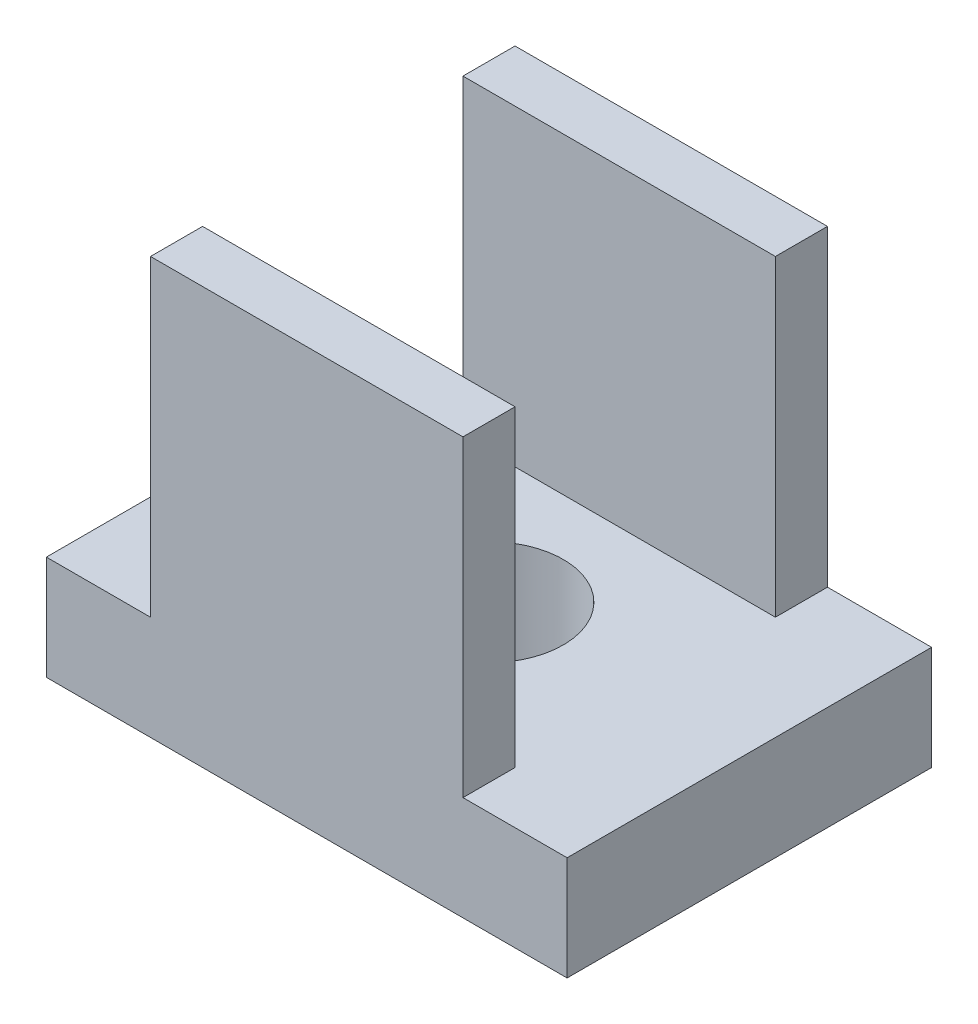
ISO-10303-21;
HEADER;
FILE_DESCRIPTION(('STEP AP214'),'2;1');
FILE_NAME('part.step','',(''),(''),'','','');
FILE_SCHEMA(('AUTOMOTIVE_DESIGN { 1 0 10303 214 1 1 1 1 }'));
ENDSEC;
DATA;
#1=APPLICATION_CONTEXT('core data for automotive mechanical design processes');
#2=APPLICATION_PROTOCOL_DEFINITION('international standard','automotive_design',2000,#1);
#3=PRODUCT_CONTEXT('',#1,'mechanical');
#4=PRODUCT('Part','Part','',(#3));
#5=PRODUCT_RELATED_PRODUCT_CATEGORY('part','',(#4));
#6=PRODUCT_DEFINITION_FORMATION('','',#4);
#7=PRODUCT_DEFINITION_CONTEXT('part definition',#1,'design');
#8=PRODUCT_DEFINITION('design','',#6,#7);
#9=PRODUCT_DEFINITION_SHAPE('','',#8);
#10=(LENGTH_UNIT() NAMED_UNIT(*) SI_UNIT(.MILLI.,.METRE.));
#11=(NAMED_UNIT(*) PLANE_ANGLE_UNIT() SI_UNIT($,.RADIAN.));
#12=(NAMED_UNIT(*) SI_UNIT($,.STERADIAN.) SOLID_ANGLE_UNIT());
#13=UNCERTAINTY_MEASURE_WITH_UNIT(LENGTH_MEASURE(1.E-05),#10,'distance_accuracy_value','');
#14=(GEOMETRIC_REPRESENTATION_CONTEXT(3) GLOBAL_UNCERTAINTY_ASSIGNED_CONTEXT((#13)) GLOBAL_UNIT_ASSIGNED_CONTEXT((#10,
#11,#12)) REPRESENTATION_CONTEXT('',''));
#15=CARTESIAN_POINT('',(0.,0.,0.));
#16=DIRECTION('',(0.,0.,1.));
#17=DIRECTION('',(1.,0.,0.));
#18=AXIS2_PLACEMENT_3D('',#15,#16,#17);
#19=CARTESIAN_POINT('',(0.,2.,0.));
#20=DIRECTION('',(0.,-1.,0.));
#21=DIRECTION('',(0.,0.,-1.));
#22=AXIS2_PLACEMENT_3D('',#19,#20,#21);
#23=PLANE('',#22);
#24=CARTESIAN_POINT('',(0.,2.,0.));
#25=DIRECTION('',(0.,1.,0.));
#26=DIRECTION('',(0.,0.,1.));
#27=AXIS2_PLACEMENT_3D('',#24,#25,#26);
#28=CIRCLE('',#27,1.425);
#29=CARTESIAN_POINT('',(0.,2.,1.425));
#30=VERTEX_POINT('',#29);
#31=EDGE_CURVE('E201',#30,#30,#28,.T.);
#32=ORIENTED_EDGE('',*,*,#31,.F.);
#33=EDGE_LOOP('',(#32));
#34=FACE_BOUND('',#33,.T.);
#35=DIRECTION('',(0.,0.,1.));
#36=VECTOR('',#35,1.);
#37=CARTESIAN_POINT('',(-3.,2.,3.5));
#38=LINE('',#37,#36);
#39=CARTESIAN_POINT('',(-3.,2.,2.5));
#40=VERTEX_POINT('',#39);
#41=CARTESIAN_POINT('',(-3.,2.,3.5));
#42=VERTEX_POINT('',#41);
#43=EDGE_CURVE('E55',#40,#42,#38,.T.);
#44=ORIENTED_EDGE('',*,*,#43,.F.);
#45=DIRECTION('',(-1.,0.,0.));
#46=VECTOR('',#45,1.);
#47=CARTESIAN_POINT('',(-3.,2.,2.5));
#48=LINE('',#47,#46);
#49=CARTESIAN_POINT('',(3.,2.,2.5));
#50=VERTEX_POINT('',#49);
#51=EDGE_CURVE('E59',#50,#40,#48,.T.);
#52=ORIENTED_EDGE('',*,*,#51,.F.);
#53=DIRECTION('',(0.,0.,-1.));
#54=VECTOR('',#53,1.);
#55=CARTESIAN_POINT('',(3.,2.,3.5));
#56=LINE('',#55,#54);
#57=CARTESIAN_POINT('',(3.,2.,3.5));
#58=VERTEX_POINT('',#57);
#59=EDGE_CURVE('E261',#58,#50,#56,.T.);
#60=ORIENTED_EDGE('',*,*,#59,.F.);
#61=DIRECTION('',(1.,0.,0.));
#62=VECTOR('',#61,1.);
#63=CARTESIAN_POINT('',(-5.,2.,3.5));
#64=LINE('',#63,#62);
#65=CARTESIAN_POINT('',(5.,2.,3.5));
#66=VERTEX_POINT('',#65);
#67=EDGE_CURVE('E221',#58,#66,#64,.T.);
#68=ORIENTED_EDGE('',*,*,#67,.T.);
#69=DIRECTION('',(0.,0.,-1.));
#70=VECTOR('',#69,1.);
#71=CARTESIAN_POINT('',(5.,2.,3.5));
#72=LINE('',#71,#70);
#73=CARTESIAN_POINT('',(5.,2.,-3.5));
#74=VERTEX_POINT('',#73);
#75=EDGE_CURVE('E209',#66,#74,#72,.T.);
#76=ORIENTED_EDGE('',*,*,#75,.T.);
#77=DIRECTION('',(-1.,0.,0.));
#78=VECTOR('',#77,1.);
#79=CARTESIAN_POINT('',(-5.,2.,-3.5));
#80=LINE('',#79,#78);
#81=CARTESIAN_POINT('',(3.,2.,-3.5));
#82=VERTEX_POINT('',#81);
#83=EDGE_CURVE('E215',#74,#82,#80,.T.);
#84=ORIENTED_EDGE('',*,*,#83,.T.);
#85=DIRECTION('',(0.,0.,-1.));
#86=VECTOR('',#85,1.);
#87=CARTESIAN_POINT('',(3.,2.,-3.5));
#88=LINE('',#87,#86);
#89=CARTESIAN_POINT('',(3.,2.,-2.5));
#90=VERTEX_POINT('',#89);
#91=EDGE_CURVE('E169',#90,#82,#88,.T.);
#92=ORIENTED_EDGE('',*,*,#91,.F.);
#93=DIRECTION('',(1.,0.,0.));
#94=VECTOR('',#93,1.);
#95=CARTESIAN_POINT('',(-3.,2.,-2.5));
#96=LINE('',#95,#94);
#97=CARTESIAN_POINT('',(-3.,2.,-2.5));
#98=VERTEX_POINT('',#97);
#99=EDGE_CURVE('E158',#98,#90,#96,.T.);
#100=ORIENTED_EDGE('',*,*,#99,.F.);
#101=DIRECTION('',(0.,0.,1.));
#102=VECTOR('',#101,1.);
#103=CARTESIAN_POINT('',(-3.,2.,-3.5));
#104=LINE('',#103,#102);
#105=CARTESIAN_POINT('',(-3.,2.,-3.5));
#106=VERTEX_POINT('',#105);
#107=EDGE_CURVE('E153',#106,#98,#104,.T.);
#108=ORIENTED_EDGE('',*,*,#107,.F.);
#109=CARTESIAN_POINT('',(-5.,2.,-3.5));
#110=VERTEX_POINT('',#109);
#111=EDGE_CURVE('E213',#106,#110,#80,.T.);
#112=ORIENTED_EDGE('',*,*,#111,.T.);
#113=DIRECTION('',(0.,0.,1.));
#114=VECTOR('',#113,1.);
#115=CARTESIAN_POINT('',(-5.,2.,3.5));
#116=LINE('',#115,#114);
#117=CARTESIAN_POINT('',(-5.,2.,3.5));
#118=VERTEX_POINT('',#117);
#119=EDGE_CURVE('E218',#110,#118,#116,.T.);
#120=ORIENTED_EDGE('',*,*,#119,.T.);
#121=EDGE_CURVE('E222',#118,#42,#64,.T.);
#122=ORIENTED_EDGE('',*,*,#121,.T.);
#123=EDGE_LOOP('',(#44,#52,#60,#68,#76,#84,#92,#100,#108,#112,#120,#122));
#124=FACE_BOUND('',#123,.T.);
#125=ADVANCED_FACE('F39',(#34,#124),#23,.F.);
#126=CARTESIAN_POINT('',(5.,2.,3.5));
#127=DIRECTION('',(-1.,0.,0.));
#128=DIRECTION('',(0.,0.,1.));
#129=AXIS2_PLACEMENT_3D('',#126,#127,#128);
#130=PLANE('',#129);
#131=DIRECTION('',(0.,0.,-1.));
#132=VECTOR('',#131,1.);
#133=CARTESIAN_POINT('',(5.,0.,3.5));
#134=LINE('',#133,#132);
#135=CARTESIAN_POINT('',(5.,0.,3.5));
#136=VERTEX_POINT('',#135);
#137=CARTESIAN_POINT('',(5.,0.,-3.5));
#138=VERTEX_POINT('',#137);
#139=EDGE_CURVE('E205',#136,#138,#134,.T.);
#140=ORIENTED_EDGE('',*,*,#139,.T.);
#141=DIRECTION('',(0.,-1.,0.));
#142=VECTOR('',#141,1.);
#143=CARTESIAN_POINT('',(5.,2.,-3.5));
#144=LINE('',#143,#142);
#145=EDGE_CURVE('E11',#74,#138,#144,.T.);
#146=ORIENTED_EDGE('',*,*,#145,.F.);
#147=ORIENTED_EDGE('',*,*,#75,.F.);
#148=DIRECTION('',(0.,-1.,0.));
#149=VECTOR('',#148,1.);
#150=CARTESIAN_POINT('',(5.,2.,3.5));
#151=LINE('',#150,#149);
#152=EDGE_CURVE('E225',#66,#136,#151,.T.);
#153=ORIENTED_EDGE('',*,*,#152,.T.);
#154=EDGE_LOOP('',(#140,#146,#147,#153));
#155=FACE_BOUND('',#154,.T.);
#156=ADVANCED_FACE('F41',(#155),#130,.F.);
#157=CARTESIAN_POINT('',(-5.,2.,-3.5));
#158=DIRECTION('',(0.,0.,1.));
#159=DIRECTION('',(1.,0.,0.));
#160=AXIS2_PLACEMENT_3D('',#157,#158,#159);
#161=PLANE('',#160);
#162=DIRECTION('',(-1.,0.,0.));
#163=VECTOR('',#162,1.);
#164=CARTESIAN_POINT('',(-5.,0.,-3.5));
#165=LINE('',#164,#163);
#166=CARTESIAN_POINT('',(-5.,0.,-3.5));
#167=VERTEX_POINT('',#166);
#168=EDGE_CURVE('E229',#138,#167,#165,.T.);
#169=ORIENTED_EDGE('',*,*,#168,.T.);
#170=DIRECTION('',(0.,-1.,0.));
#171=VECTOR('',#170,1.);
#172=CARTESIAN_POINT('',(-5.,2.,-3.5));
#173=LINE('',#172,#171);
#174=EDGE_CURVE('E48',#110,#167,#173,.T.);
#175=ORIENTED_EDGE('',*,*,#174,.F.);
#176=ORIENTED_EDGE('',*,*,#111,.F.);
#177=DIRECTION('',(0.,-1.,0.));
#178=VECTOR('',#177,1.);
#179=CARTESIAN_POINT('',(-3.,8.,-3.5));
#180=LINE('',#179,#178);
#181=CARTESIAN_POINT('',(-3.,8.,-3.5));
#182=VERTEX_POINT('',#181);
#183=EDGE_CURVE('E177',#182,#106,#180,.T.);
#184=ORIENTED_EDGE('',*,*,#183,.F.);
#185=DIRECTION('',(-1.,0.,0.));
#186=VECTOR('',#185,1.);
#187=CARTESIAN_POINT('',(-3.,8.,-3.5));
#188=LINE('',#187,#186);
#189=CARTESIAN_POINT('',(3.,8.,-3.5));
#190=VERTEX_POINT('',#189);
#191=EDGE_CURVE('E175',#190,#182,#188,.T.);
#192=ORIENTED_EDGE('',*,*,#191,.F.);
#193=DIRECTION('',(0.,-1.,0.));
#194=VECTOR('',#193,1.);
#195=CARTESIAN_POINT('',(3.,8.,-3.5));
#196=LINE('',#195,#194);
#197=EDGE_CURVE('E188',#190,#82,#196,.T.);
#198=ORIENTED_EDGE('',*,*,#197,.T.);
#199=ORIENTED_EDGE('',*,*,#83,.F.);
#200=ORIENTED_EDGE('',*,*,#145,.T.);
#201=EDGE_LOOP('',(#169,#175,#176,#184,#192,#198,#199,#200));
#202=FACE_BOUND('',#201,.T.);
#203=ADVANCED_FACE('F265',(#202),#161,.F.);
#204=CARTESIAN_POINT('',(-5.,2.,3.5));
#205=DIRECTION('',(1.,0.,0.));
#206=DIRECTION('',(0.,0.,-1.));
#207=AXIS2_PLACEMENT_3D('',#204,#205,#206);
#208=PLANE('',#207);
#209=DIRECTION('',(0.,0.,1.));
#210=VECTOR('',#209,1.);
#211=CARTESIAN_POINT('',(-5.,0.,3.5));
#212=LINE('',#211,#210);
#213=CARTESIAN_POINT('',(-5.,0.,3.5));
#214=VERTEX_POINT('',#213);
#215=EDGE_CURVE('E232',#167,#214,#212,.T.);
#216=ORIENTED_EDGE('',*,*,#215,.T.);
#217=DIRECTION('',(0.,-1.,0.));
#218=VECTOR('',#217,1.);
#219=CARTESIAN_POINT('',(-5.,2.,3.5));
#220=LINE('',#219,#218);
#221=EDGE_CURVE('E240',#118,#214,#220,.T.);
#222=ORIENTED_EDGE('',*,*,#221,.F.);
#223=ORIENTED_EDGE('',*,*,#119,.F.);
#224=ORIENTED_EDGE('',*,*,#174,.T.);
#225=EDGE_LOOP('',(#216,#222,#223,#224));
#226=FACE_BOUND('',#225,.T.);
#227=ADVANCED_FACE('F249',(#226),#208,.F.);
#228=CARTESIAN_POINT('',(-5.,2.,3.5));
#229=DIRECTION('',(0.,0.,-1.));
#230=DIRECTION('',(-1.,0.,0.));
#231=AXIS2_PLACEMENT_3D('',#228,#229,#230);
#232=PLANE('',#231);
#233=DIRECTION('',(1.,0.,0.));
#234=VECTOR('',#233,1.);
#235=CARTESIAN_POINT('',(-5.,0.,3.5));
#236=LINE('',#235,#234);
#237=EDGE_CURVE('E214',#214,#136,#236,.T.);
#238=ORIENTED_EDGE('',*,*,#237,.T.);
#239=ORIENTED_EDGE('',*,*,#152,.F.);
#240=ORIENTED_EDGE('',*,*,#67,.F.);
#241=DIRECTION('',(0.,-1.,0.));
#242=VECTOR('',#241,1.);
#243=CARTESIAN_POINT('',(3.,8.,3.5));
#244=LINE('',#243,#242);
#245=CARTESIAN_POINT('',(3.,8.,3.5));
#246=VERTEX_POINT('',#245);
#247=EDGE_CURVE('E135',#246,#58,#244,.T.);
#248=ORIENTED_EDGE('',*,*,#247,.F.);
#249=DIRECTION('',(1.,0.,0.));
#250=VECTOR('',#249,1.);
#251=CARTESIAN_POINT('',(-3.,8.,3.5));
#252=LINE('',#251,#250);
#253=CARTESIAN_POINT('',(-3.,8.,3.5));
#254=VERTEX_POINT('',#253);
#255=EDGE_CURVE('E128',#254,#246,#252,.T.);
#256=ORIENTED_EDGE('',*,*,#255,.F.);
#257=DIRECTION('',(0.,-1.,0.));
#258=VECTOR('',#257,1.);
#259=CARTESIAN_POINT('',(-3.,8.,3.5));
#260=LINE('',#259,#258);
#261=EDGE_CURVE('E133',#254,#42,#260,.T.);
#262=ORIENTED_EDGE('',*,*,#261,.T.);
#263=ORIENTED_EDGE('',*,*,#121,.F.);
#264=ORIENTED_EDGE('',*,*,#221,.T.);
#265=EDGE_LOOP('',(#238,#239,#240,#248,#256,#262,#263,#264));
#266=FACE_BOUND('',#265,.T.);
#267=ADVANCED_FACE('F130',(#266),#232,.F.);
#268=CARTESIAN_POINT('',(0.,0.,0.));
#269=DIRECTION('',(0.,-1.,0.));
#270=DIRECTION('',(0.,0.,-1.));
#271=AXIS2_PLACEMENT_3D('',#268,#269,#270);
#272=PLANE('',#271);
#273=CARTESIAN_POINT('',(0.,0.,0.));
#274=DIRECTION('',(0.,-1.,0.));
#275=DIRECTION('',(0.,0.,-1.));
#276=AXIS2_PLACEMENT_3D('',#273,#274,#275);
#277=CIRCLE('',#276,1.425);
#278=CARTESIAN_POINT('',(0.,0.,-1.425));
#279=VERTEX_POINT('',#278);
#280=EDGE_CURVE('E200',#279,#279,#277,.F.);
#281=ORIENTED_EDGE('',*,*,#280,.T.);
#282=EDGE_LOOP('',(#281));
#283=FACE_BOUND('',#282,.T.);
#284=ORIENTED_EDGE('',*,*,#139,.F.);
#285=ORIENTED_EDGE('',*,*,#237,.F.);
#286=ORIENTED_EDGE('',*,*,#215,.F.);
#287=ORIENTED_EDGE('',*,*,#168,.F.);
#288=EDGE_LOOP('',(#284,#285,#286,#287));
#289=FACE_BOUND('',#288,.T.);
#290=ADVANCED_FACE('F256',(#283,#289),#272,.T.);
#291=CARTESIAN_POINT('',(0.,-0.00100000000000013,0.));
#292=DIRECTION('',(0.,1.,0.));
#293=DIRECTION('',(0.,0.,1.));
#294=AXIS2_PLACEMENT_3D('',#291,#292,#293);
#295=CYLINDRICAL_SURFACE('',#294,1.425);
#296=ORIENTED_EDGE('',*,*,#280,.F.);
#297=EDGE_LOOP('',(#296));
#298=FACE_BOUND('',#297,.T.);
#299=ORIENTED_EDGE('',*,*,#31,.T.);
#300=EDGE_LOOP('',(#299));
#301=FACE_BOUND('',#300,.T.);
#302=ADVANCED_FACE('F287',(#298,#301),#295,.F.);
#303=CARTESIAN_POINT('',(-3.,8.,-3.5));
#304=DIRECTION('',(1.,0.,0.));
#305=DIRECTION('',(0.,0.,-1.));
#306=AXIS2_PLACEMENT_3D('',#303,#304,#305);
#307=PLANE('',#306);
#308=ORIENTED_EDGE('',*,*,#107,.T.);
#309=DIRECTION('',(0.,-1.,0.));
#310=VECTOR('',#309,1.);
#311=CARTESIAN_POINT('',(-3.,8.,-2.5));
#312=LINE('',#311,#310);
#313=CARTESIAN_POINT('',(-3.,8.,-2.5));
#314=VERTEX_POINT('',#313);
#315=EDGE_CURVE('E196',#314,#98,#312,.T.);
#316=ORIENTED_EDGE('',*,*,#315,.F.);
#317=DIRECTION('',(0.,0.,1.));
#318=VECTOR('',#317,1.);
#319=CARTESIAN_POINT('',(-3.,8.,-3.5));
#320=LINE('',#319,#318);
#321=EDGE_CURVE('E164',#182,#314,#320,.T.);
#322=ORIENTED_EDGE('',*,*,#321,.F.);
#323=ORIENTED_EDGE('',*,*,#183,.T.);
#324=EDGE_LOOP('',(#308,#316,#322,#323));
#325=FACE_BOUND('',#324,.T.);
#326=ADVANCED_FACE('F269',(#325),#307,.F.);
#327=CARTESIAN_POINT('',(-3.,8.,-2.5));
#328=DIRECTION('',(0.,0.,-1.));
#329=DIRECTION('',(-1.,0.,0.));
#330=AXIS2_PLACEMENT_3D('',#327,#328,#329);
#331=PLANE('',#330);
#332=ORIENTED_EDGE('',*,*,#99,.T.);
#333=DIRECTION('',(0.,-1.,0.));
#334=VECTOR('',#333,1.);
#335=CARTESIAN_POINT('',(3.,8.,-2.5));
#336=LINE('',#335,#334);
#337=CARTESIAN_POINT('',(3.,8.,-2.5));
#338=VERTEX_POINT('',#337);
#339=EDGE_CURVE('E192',#338,#90,#336,.T.);
#340=ORIENTED_EDGE('',*,*,#339,.F.);
#341=DIRECTION('',(1.,0.,0.));
#342=VECTOR('',#341,1.);
#343=CARTESIAN_POINT('',(-3.,8.,-2.5));
#344=LINE('',#343,#342);
#345=EDGE_CURVE('E168',#314,#338,#344,.T.);
#346=ORIENTED_EDGE('',*,*,#345,.F.);
#347=ORIENTED_EDGE('',*,*,#315,.T.);
#348=EDGE_LOOP('',(#332,#340,#346,#347));
#349=FACE_BOUND('',#348,.T.);
#350=ADVANCED_FACE('F279',(#349),#331,.F.);
#351=CARTESIAN_POINT('',(3.,8.,-3.5));
#352=DIRECTION('',(-1.,0.,0.));
#353=DIRECTION('',(0.,0.,1.));
#354=AXIS2_PLACEMENT_3D('',#351,#352,#353);
#355=PLANE('',#354);
#356=ORIENTED_EDGE('',*,*,#91,.T.);
#357=ORIENTED_EDGE('',*,*,#197,.F.);
#358=DIRECTION('',(0.,0.,-1.));
#359=VECTOR('',#358,1.);
#360=CARTESIAN_POINT('',(3.,8.,-3.5));
#361=LINE('',#360,#359);
#362=EDGE_CURVE('E172',#338,#190,#361,.T.);
#363=ORIENTED_EDGE('',*,*,#362,.F.);
#364=ORIENTED_EDGE('',*,*,#339,.T.);
#365=EDGE_LOOP('',(#356,#357,#363,#364));
#366=FACE_BOUND('',#365,.T.);
#367=ADVANCED_FACE('F277',(#366),#355,.F.);
#368=CARTESIAN_POINT('',(0.,8.,0.));
#369=DIRECTION('',(0.,1.,0.));
#370=DIRECTION('',(0.,0.,1.));
#371=AXIS2_PLACEMENT_3D('',#368,#369,#370);
#372=PLANE('',#371);
#373=ORIENTED_EDGE('',*,*,#321,.T.);
#374=ORIENTED_EDGE('',*,*,#345,.T.);
#375=ORIENTED_EDGE('',*,*,#362,.T.);
#376=ORIENTED_EDGE('',*,*,#191,.T.);
#377=EDGE_LOOP('',(#373,#374,#375,#376));
#378=FACE_BOUND('',#377,.T.);
#379=ADVANCED_FACE('F272',(#378),#372,.T.);
#380=CARTESIAN_POINT('',(-3.,8.,3.5));
#381=DIRECTION('',(1.,0.,0.));
#382=DIRECTION('',(0.,0.,-1.));
#383=AXIS2_PLACEMENT_3D('',#380,#381,#382);
#384=PLANE('',#383);
#385=ORIENTED_EDGE('',*,*,#43,.T.);
#386=ORIENTED_EDGE('',*,*,#261,.F.);
#387=DIRECTION('',(0.,0.,1.));
#388=VECTOR('',#387,1.);
#389=CARTESIAN_POINT('',(-3.,8.,3.5));
#390=LINE('',#389,#388);
#391=CARTESIAN_POINT('',(-3.,8.,2.5));
#392=VERTEX_POINT('',#391);
#393=EDGE_CURVE('E140',#392,#254,#390,.T.);
#394=ORIENTED_EDGE('',*,*,#393,.F.);
#395=DIRECTION('',(0.,-1.,0.));
#396=VECTOR('',#395,1.);
#397=CARTESIAN_POINT('',(-3.,8.,2.5));
#398=LINE('',#397,#396);
#399=EDGE_CURVE('E390',#392,#40,#398,.T.);
#400=ORIENTED_EDGE('',*,*,#399,.T.);
#401=EDGE_LOOP('',(#385,#386,#394,#400));
#402=FACE_BOUND('',#401,.T.);
#403=ADVANCED_FACE('F151',(#402),#384,.F.);
#404=CARTESIAN_POINT('',(3.,8.,3.5));
#405=DIRECTION('',(-1.,0.,0.));
#406=DIRECTION('',(0.,0.,1.));
#407=AXIS2_PLACEMENT_3D('',#404,#405,#406);
#408=PLANE('',#407);
#409=ORIENTED_EDGE('',*,*,#59,.T.);
#410=DIRECTION('',(0.,-1.,0.));
#411=VECTOR('',#410,1.);
#412=CARTESIAN_POINT('',(3.,8.,2.5));
#413=LINE('',#412,#411);
#414=CARTESIAN_POINT('',(3.,8.,2.5));
#415=VERTEX_POINT('',#414);
#416=EDGE_CURVE('E160',#415,#50,#413,.T.);
#417=ORIENTED_EDGE('',*,*,#416,.F.);
#418=DIRECTION('',(0.,0.,-1.));
#419=VECTOR('',#418,1.);
#420=CARTESIAN_POINT('',(3.,8.,3.5));
#421=LINE('',#420,#419);
#422=EDGE_CURVE('E139',#246,#415,#421,.T.);
#423=ORIENTED_EDGE('',*,*,#422,.F.);
#424=ORIENTED_EDGE('',*,*,#247,.T.);
#425=EDGE_LOOP('',(#409,#417,#423,#424));
#426=FACE_BOUND('',#425,.T.);
#427=ADVANCED_FACE('F358',(#426),#408,.F.);
#428=CARTESIAN_POINT('',(-3.,8.,2.5));
#429=DIRECTION('',(0.,0.,1.));
#430=DIRECTION('',(1.,0.,0.));
#431=AXIS2_PLACEMENT_3D('',#428,#429,#430);
#432=PLANE('',#431);
#433=ORIENTED_EDGE('',*,*,#51,.T.);
#434=ORIENTED_EDGE('',*,*,#399,.F.);
#435=DIRECTION('',(-1.,0.,0.));
#436=VECTOR('',#435,1.);
#437=CARTESIAN_POINT('',(-3.,8.,2.5));
#438=LINE('',#437,#436);
#439=EDGE_CURVE('E145',#415,#392,#438,.T.);
#440=ORIENTED_EDGE('',*,*,#439,.F.);
#441=ORIENTED_EDGE('',*,*,#416,.T.);
#442=EDGE_LOOP('',(#433,#434,#440,#441));
#443=FACE_BOUND('',#442,.T.);
#444=ADVANCED_FACE('F367',(#443),#432,.F.);
#445=CARTESIAN_POINT('',(0.,8.,0.));
#446=DIRECTION('',(0.,-1.,0.));
#447=DIRECTION('',(0.,0.,-1.));
#448=AXIS2_PLACEMENT_3D('',#445,#446,#447);
#449=PLANE('',#448);
#450=ORIENTED_EDGE('',*,*,#393,.T.);
#451=ORIENTED_EDGE('',*,*,#255,.T.);
#452=ORIENTED_EDGE('',*,*,#422,.T.);
#453=ORIENTED_EDGE('',*,*,#439,.T.);
#454=EDGE_LOOP('',(#450,#451,#452,#453));
#455=FACE_BOUND('',#454,.T.);
#456=ADVANCED_FACE('F143',(#455),#449,.F.);
#457=CLOSED_SHELL('',(#125,#156,#203,#227,#267,#290,#302,#326,#350,#367,#379,#403,#427,#444,#456));
#458=MANIFOLD_SOLID_BREP('B2',#457);
#459=ADVANCED_BREP_SHAPE_REPRESENTATION('',(#18,#458),#14);
#460=SHAPE_DEFINITION_REPRESENTATION(#9,#459);
ENDSEC;
END-ISO-10303-21;
